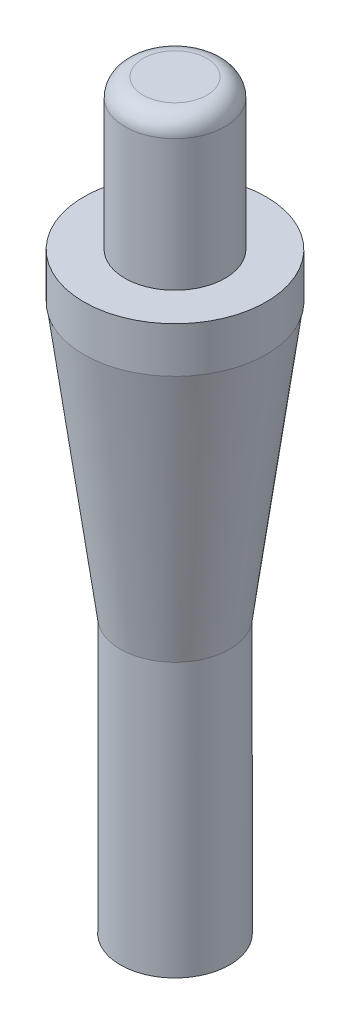
ISO-10303-21;
HEADER;
FILE_DESCRIPTION(('STEP AP214'),'2;1');
FILE_NAME('part.step','',(''),(''),'','','');
FILE_SCHEMA(('AUTOMOTIVE_DESIGN { 1 0 10303 214 1 1 1 1 }'));
ENDSEC;
DATA;
#1=APPLICATION_CONTEXT('core data for automotive mechanical design processes');
#2=APPLICATION_PROTOCOL_DEFINITION('international standard','automotive_design',2000,#1);
#3=PRODUCT_CONTEXT('',#1,'mechanical');
#4=PRODUCT('Part','Part','',(#3));
#5=PRODUCT_RELATED_PRODUCT_CATEGORY('part','',(#4));
#6=PRODUCT_DEFINITION_FORMATION('','',#4);
#7=PRODUCT_DEFINITION_CONTEXT('part definition',#1,'design');
#8=PRODUCT_DEFINITION('design','',#6,#7);
#9=PRODUCT_DEFINITION_SHAPE('','',#8);
#10=(LENGTH_UNIT() NAMED_UNIT(*) SI_UNIT(.MILLI.,.METRE.));
#11=(NAMED_UNIT(*) PLANE_ANGLE_UNIT() SI_UNIT($,.RADIAN.));
#12=(NAMED_UNIT(*) SI_UNIT($,.STERADIAN.) SOLID_ANGLE_UNIT());
#13=UNCERTAINTY_MEASURE_WITH_UNIT(LENGTH_MEASURE(1.E-05),#10,'distance_accuracy_value','');
#14=(GEOMETRIC_REPRESENTATION_CONTEXT(3) GLOBAL_UNCERTAINTY_ASSIGNED_CONTEXT((#13)) GLOBAL_UNIT_ASSIGNED_CONTEXT((#10,
#11,#12)) REPRESENTATION_CONTEXT('',''));
#15=CARTESIAN_POINT('',(0.,0.,0.));
#16=DIRECTION('',(0.,0.,1.));
#17=DIRECTION('',(1.,0.,0.));
#18=AXIS2_PLACEMENT_3D('',#15,#16,#17);
#19=CARTESIAN_POINT('',(0.,25.7,2.75));
#20=DIRECTION('',(0.,1.,0.));
#21=DIRECTION('',(0.,0.,1.));
#22=AXIS2_PLACEMENT_3D('',#19,#20,#21);
#23=PLANE('',#22);
#24=CARTESIAN_POINT('',(0.,25.7,0.));
#25=DIRECTION('',(0.,1.,0.));
#26=DIRECTION('',(0.,0.,1.));
#27=AXIS2_PLACEMENT_3D('',#24,#25,#26);
#28=CIRCLE('',#27,1.75);
#29=CARTESIAN_POINT('',(0.,25.7,1.75));
#30=VERTEX_POINT('',#29);
#31=EDGE_CURVE('E50',#30,#30,#28,.T.);
#32=ORIENTED_EDGE('',*,*,#31,.T.);
#33=EDGE_LOOP('',(#32));
#34=FACE_BOUND('',#33,.T.);
#35=ADVANCED_FACE('F34',(#34),#23,.T.);
#36=CARTESIAN_POINT('',(0.,26.5713826034208,0.));
#37=DIRECTION('',(0.,1.,0.));
#38=DIRECTION('',(0.,0.,1.));
#39=AXIS2_PLACEMENT_3D('',#36,#37,#38);
#40=CYLINDRICAL_SURFACE('',#39,2.75);
#41=CARTESIAN_POINT('',(0.,24.7,0.));
#42=DIRECTION('',(0.,1.,0.));
#43=DIRECTION('',(0.,0.,1.));
#44=AXIS2_PLACEMENT_3D('',#41,#42,#43);
#45=CIRCLE('',#44,2.75);
#46=CARTESIAN_POINT('',(0.,24.7,2.75));
#47=VERTEX_POINT('',#46);
#48=EDGE_CURVE('E46',#47,#47,#45,.F.);
#49=ORIENTED_EDGE('',*,*,#48,.T.);
#50=EDGE_LOOP('',(#49));
#51=FACE_BOUND('',#50,.T.);
#52=CARTESIAN_POINT('',(0.,17.5,0.));
#53=DIRECTION('',(0.,1.,0.));
#54=DIRECTION('',(0.,0.,1.));
#55=AXIS2_PLACEMENT_3D('',#52,#53,#54);
#56=CIRCLE('',#55,2.75);
#57=CARTESIAN_POINT('',(0.,17.5,2.75));
#58=VERTEX_POINT('',#57);
#59=EDGE_CURVE('E55',#58,#58,#56,.T.);
#60=ORIENTED_EDGE('',*,*,#59,.T.);
#61=EDGE_LOOP('',(#60));
#62=FACE_BOUND('',#61,.T.);
#63=ADVANCED_FACE('F89',(#51,#62),#40,.T.);
#64=CARTESIAN_POINT('',(0.,17.5,2.75));
#65=DIRECTION('',(0.,1.,0.));
#66=DIRECTION('',(0.,0.,1.));
#67=AXIS2_PLACEMENT_3D('',#64,#65,#66);
#68=PLANE('',#67);
#69=CARTESIAN_POINT('',(0.,17.5,0.));
#70=DIRECTION('',(0.,1.,0.));
#71=DIRECTION('',(0.,0.,1.));
#72=AXIS2_PLACEMENT_3D('',#69,#70,#71);
#73=CIRCLE('',#72,5.);
#74=CARTESIAN_POINT('',(0.,17.5,5.));
#75=VERTEX_POINT('',#74);
#76=EDGE_CURVE('E58',#75,#75,#73,.T.);
#77=ORIENTED_EDGE('',*,*,#76,.T.);
#78=EDGE_LOOP('',(#77));
#79=FACE_BOUND('',#78,.T.);
#80=ORIENTED_EDGE('',*,*,#59,.F.);
#81=EDGE_LOOP('',(#80));
#82=FACE_BOUND('',#81,.T.);
#83=ADVANCED_FACE('F95',(#79,#82),#68,.T.);
#84=CARTESIAN_POINT('',(0.,26.5713826034208,0.));
#85=DIRECTION('',(0.,1.,0.));
#86=DIRECTION('',(0.,0.,1.));
#87=AXIS2_PLACEMENT_3D('',#84,#85,#86);
#88=CYLINDRICAL_SURFACE('',#87,5.);
#89=CARTESIAN_POINT('',(0.,15.,0.));
#90=DIRECTION('',(0.,1.,0.));
#91=DIRECTION('',(0.,0.,1.));
#92=AXIS2_PLACEMENT_3D('',#89,#90,#91);
#93=CIRCLE('',#92,5.);
#94=CARTESIAN_POINT('',(0.,15.,5.));
#95=VERTEX_POINT('',#94);
#96=EDGE_CURVE('E61',#95,#95,#93,.T.);
#97=ORIENTED_EDGE('',*,*,#96,.T.);
#98=EDGE_LOOP('',(#97));
#99=FACE_BOUND('',#98,.T.);
#100=ORIENTED_EDGE('',*,*,#76,.F.);
#101=EDGE_LOOP('',(#100));
#102=FACE_BOUND('',#101,.T.);
#103=ADVANCED_FACE('F101',(#99,#102),#88,.T.);
#104=CARTESIAN_POINT('',(0.,15.,5.));
#105=DIRECTION('',(0.,-1.,0.));
#106=DIRECTION('',(0.,0.,-1.));
#107=AXIS2_PLACEMENT_3D('',#104,#105,#106);
#108=PLANE('',#107);
#109=CARTESIAN_POINT('',(0.,15.,0.));
#110=DIRECTION('',(0.,-1.,0.));
#111=DIRECTION('',(0.,0.,-1.));
#112=AXIS2_PLACEMENT_3D('',#109,#110,#111);
#113=CIRCLE('',#112,4.97478746381096);
#114=CARTESIAN_POINT('',(0.,15.,-4.97478746381096));
#115=VERTEX_POINT('',#114);
#116=EDGE_CURVE('E42',#115,#115,#113,.F.);
#117=ORIENTED_EDGE('',*,*,#116,.T.);
#118=EDGE_LOOP('',(#117));
#119=FACE_BOUND('',#118,.T.);
#120=ORIENTED_EDGE('',*,*,#96,.F.);
#121=EDGE_LOOP('',(#120));
#122=FACE_BOUND('',#121,.T.);
#123=ADVANCED_FACE('F105',(#119,#122),#108,.T.);
#124=CARTESIAN_POINT('',(0.,26.5713826034208,0.));
#125=DIRECTION('',(0.,1.,0.));
#126=DIRECTION('',(0.,0.,1.));
#127=AXIS2_PLACEMENT_3D('',#124,#125,#126);
#128=CYLINDRICAL_SURFACE('',#127,3.);
#129=CARTESIAN_POINT('',(0.,2.1163626406917E-13,0.));
#130=DIRECTION('',(0.,-1.,0.));
#131=DIRECTION('',(0.,0.,-1.));
#132=AXIS2_PLACEMENT_3D('',#129,#130,#131);
#133=CIRCLE('',#132,3.);
#134=CARTESIAN_POINT('',(0.,2.1163626406917E-13,-3.));
#135=VERTEX_POINT('',#134);
#136=EDGE_CURVE('E10',#135,#135,#133,.T.);
#137=ORIENTED_EDGE('',*,*,#136,.T.);
#138=EDGE_LOOP('',(#137));
#139=FACE_BOUND('',#138,.T.);
#140=CARTESIAN_POINT('',(0.,-15.,0.));
#141=DIRECTION('',(0.,1.,0.));
#142=DIRECTION('',(0.,0.,1.));
#143=AXIS2_PLACEMENT_3D('',#140,#141,#142);
#144=CIRCLE('',#143,3.);
#145=CARTESIAN_POINT('',(0.,-15.,3.));
#146=VERTEX_POINT('',#145);
#147=EDGE_CURVE('E64',#146,#146,#144,.T.);
#148=ORIENTED_EDGE('',*,*,#147,.T.);
#149=EDGE_LOOP('',(#148));
#150=FACE_BOUND('',#149,.T.);
#151=ADVANCED_FACE('F109',(#139,#150),#128,.T.);
#152=CARTESIAN_POINT('',(0.,-15.,3.));
#153=DIRECTION('',(0.,-1.,0.));
#154=DIRECTION('',(0.,0.,-1.));
#155=AXIS2_PLACEMENT_3D('',#152,#153,#154);
#156=PLANE('',#155);
#157=CARTESIAN_POINT('',(0.,-15.,0.));
#158=DIRECTION('',(0.,1.,0.));
#159=DIRECTION('',(0.,0.,1.));
#160=AXIS2_PLACEMENT_3D('',#157,#158,#159);
#161=CIRCLE('',#160,1.59999999999999);
#162=CARTESIAN_POINT('',(0.,-15.,1.59999999999999));
#163=VERTEX_POINT('',#162);
#164=EDGE_CURVE('E67',#163,#163,#161,.T.);
#165=ORIENTED_EDGE('',*,*,#164,.T.);
#166=EDGE_LOOP('',(#165));
#167=FACE_BOUND('',#166,.T.);
#168=ORIENTED_EDGE('',*,*,#147,.F.);
#169=EDGE_LOOP('',(#168));
#170=FACE_BOUND('',#169,.T.);
#171=ADVANCED_FACE('F86',(#167,#170),#156,.T.);
#172=CARTESIAN_POINT('',(0.,26.5713826034208,0.));
#173=DIRECTION('',(0.,1.,0.));
#174=DIRECTION('',(0.,0.,1.));
#175=AXIS2_PLACEMENT_3D('',#172,#173,#174);
#176=CYLINDRICAL_SURFACE('',#175,1.59999999999999);
#177=CARTESIAN_POINT('',(0.,10.,0.));
#178=DIRECTION('',(0.,1.,0.));
#179=DIRECTION('',(0.,0.,1.));
#180=AXIS2_PLACEMENT_3D('',#177,#178,#179);
#181=CIRCLE('',#180,1.59999999999999);
#182=CARTESIAN_POINT('',(0.,10.,1.59999999999999));
#183=VERTEX_POINT('',#182);
#184=EDGE_CURVE('E70',#183,#183,#181,.T.);
#185=ORIENTED_EDGE('',*,*,#184,.T.);
#186=EDGE_LOOP('',(#185));
#187=FACE_BOUND('',#186,.T.);
#188=ORIENTED_EDGE('',*,*,#164,.F.);
#189=EDGE_LOOP('',(#188));
#190=FACE_BOUND('',#189,.T.);
#191=ADVANCED_FACE('F74',(#187,#190),#176,.F.);
#192=CARTESIAN_POINT('',(0.,10.,1.59999999999999));
#193=DIRECTION('',(0.,-1.,0.));
#194=DIRECTION('',(0.,0.,-1.));
#195=AXIS2_PLACEMENT_3D('',#192,#193,#194);
#196=PLANE('',#195);
#197=ORIENTED_EDGE('',*,*,#184,.F.);
#198=EDGE_LOOP('',(#197));
#199=FACE_BOUND('',#198,.T.);
#200=ADVANCED_FACE('F77',(#199),#196,.T.);
#201=CARTESIAN_POINT('',(0.,24.7,0.));
#202=DIRECTION('',(0.,1.,0.));
#203=DIRECTION('',(0.,0.,1.));
#204=AXIS2_PLACEMENT_3D('',#201,#202,#203);
#205=TOROIDAL_SURFACE('',#204,1.75,1.);
#206=ORIENTED_EDGE('',*,*,#48,.F.);
#207=EDGE_LOOP('',(#206));
#208=FACE_BOUND('',#207,.T.);
#209=ORIENTED_EDGE('',*,*,#31,.F.);
#210=EDGE_LOOP('',(#209));
#211=FACE_BOUND('',#210,.T.);
#212=ADVANCED_FACE('F79',(#208,#211),#205,.T.);
#213=CARTESIAN_POINT('',(0.,15.,0.));
#214=DIRECTION('',(0.,1.,0.));
#215=DIRECTION('',(0.,0.,1.));
#216=AXIS2_PLACEMENT_3D('',#213,#214,#215);
#217=CONICAL_SURFACE('',#216,4.97478746381096,0.130899693899579);
#218=ORIENTED_EDGE('',*,*,#136,.F.);
#219=EDGE_LOOP('',(#218));
#220=FACE_BOUND('',#219,.T.);
#221=ORIENTED_EDGE('',*,*,#116,.F.);
#222=EDGE_LOOP('',(#221));
#223=FACE_BOUND('',#222,.T.);
#224=ADVANCED_FACE('F37',(#220,#223),#217,.T.);
#225=CLOSED_SHELL('',(#35,#63,#83,#103,#123,#151,#171,#191,#200,#212,#224));
#226=MANIFOLD_SOLID_BREP('B2',#225);
#227=ADVANCED_BREP_SHAPE_REPRESENTATION('',(#18,#226),#14);
#228=SHAPE_DEFINITION_REPRESENTATION(#9,#227);
ENDSEC;
END-ISO-10303-21;
